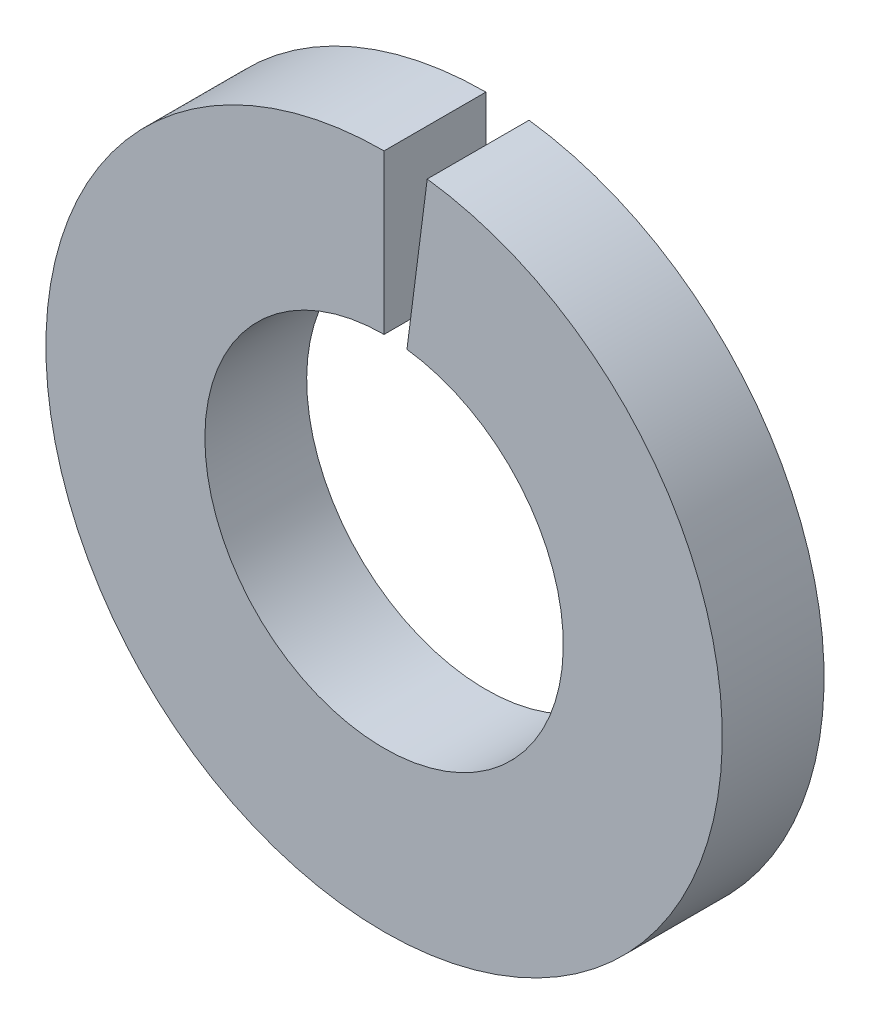
ISO-10303-21;
HEADER;
FILE_DESCRIPTION(('STEP AP214'),'2;1');
FILE_NAME('part.step','',(''),(''),'','','');
FILE_SCHEMA(('AUTOMOTIVE_DESIGN { 1 0 10303 214 1 1 1 1 }'));
ENDSEC;
DATA;
#1=APPLICATION_CONTEXT('core data for automotive mechanical design processes');
#2=APPLICATION_PROTOCOL_DEFINITION('international standard','automotive_design',2000,#1);
#3=PRODUCT_CONTEXT('',#1,'mechanical');
#4=PRODUCT('Part','Part','',(#3));
#5=PRODUCT_RELATED_PRODUCT_CATEGORY('part','',(#4));
#6=PRODUCT_DEFINITION_FORMATION('','',#4);
#7=PRODUCT_DEFINITION_CONTEXT('part definition',#1,'design');
#8=PRODUCT_DEFINITION('design','',#6,#7);
#9=PRODUCT_DEFINITION_SHAPE('','',#8);
#10=(LENGTH_UNIT() NAMED_UNIT(*) SI_UNIT(.MILLI.,.METRE.));
#11=(NAMED_UNIT(*) PLANE_ANGLE_UNIT() SI_UNIT($,.RADIAN.));
#12=(NAMED_UNIT(*) SI_UNIT($,.STERADIAN.) SOLID_ANGLE_UNIT());
#13=UNCERTAINTY_MEASURE_WITH_UNIT(LENGTH_MEASURE(1.E-05),#10,'distance_accuracy_value','');
#14=(GEOMETRIC_REPRESENTATION_CONTEXT(3) GLOBAL_UNCERTAINTY_ASSIGNED_CONTEXT((#13)) GLOBAL_UNIT_ASSIGNED_CONTEXT((#10,
#11,#12)) REPRESENTATION_CONTEXT('',''));
#15=CARTESIAN_POINT('',(0.,0.,0.));
#16=DIRECTION('',(0.,0.,1.));
#17=DIRECTION('',(1.,0.,0.));
#18=AXIS2_PLACEMENT_3D('',#15,#16,#17);
#19=CARTESIAN_POINT('',(0.,0.,1.8542));
#20=DIRECTION('',(0.,0.,1.));
#21=DIRECTION('',(1.,0.,0.));
#22=AXIS2_PLACEMENT_3D('',#19,#20,#21);
#23=PLANE('',#22);
#24=DIRECTION('',(0.127599136443187,0.991825821593163,0.));
#25=VECTOR('',#24,1.);
#26=CARTESIAN_POINT('',(0.,0.,1.8542));
#27=LINE('',#26,#25);
#28=CARTESIAN_POINT('',(0.416470821436917,3.23722029909792,1.8542));
#29=VERTEX_POINT('',#28);
#30=CARTESIAN_POINT('',(0.785946880921808,6.10915114810309,1.8542));
#31=VERTEX_POINT('',#30);
#32=EDGE_CURVE('E73',#29,#31,#27,.T.);
#33=ORIENTED_EDGE('',*,*,#32,.F.);
#34=CARTESIAN_POINT('',(0.,0.,1.8542));
#35=DIRECTION('',(0.,0.,1.));
#36=DIRECTION('',(1.,0.,0.));
#37=AXIS2_PLACEMENT_3D('',#34,#35,#36);
#38=CIRCLE('',#37,3.2639);
#39=CARTESIAN_POINT('',(0.,3.2639,1.8542));
#40=VERTEX_POINT('',#39);
#41=EDGE_CURVE('E92',#40,#29,#38,.T.);
#42=ORIENTED_EDGE('',*,*,#41,.F.);
#43=DIRECTION('',(0.,-1.,0.));
#44=VECTOR('',#43,1.);
#45=CARTESIAN_POINT('',(0.,0.,1.8542));
#46=LINE('',#45,#44);
#47=CARTESIAN_POINT('',(0.,6.1595,1.8542));
#48=VERTEX_POINT('',#47);
#49=EDGE_CURVE('E54',#48,#40,#46,.T.);
#50=ORIENTED_EDGE('',*,*,#49,.F.);
#51=CARTESIAN_POINT('',(0.,0.,1.8542));
#52=DIRECTION('',(0.,0.,1.));
#53=DIRECTION('',(1.,0.,0.));
#54=AXIS2_PLACEMENT_3D('',#51,#52,#53);
#55=CIRCLE('',#54,6.1595);
#56=EDGE_CURVE('E91',#48,#31,#55,.T.);
#57=ORIENTED_EDGE('',*,*,#56,.T.);
#58=EDGE_LOOP('',(#33,#42,#50,#57));
#59=FACE_BOUND('',#58,.T.);
#60=ADVANCED_FACE('F32',(#59),#23,.T.);
#61=CARTESIAN_POINT('',(0.,0.,0.));
#62=DIRECTION('',(0.,0.,1.));
#63=DIRECTION('',(1.,0.,0.));
#64=AXIS2_PLACEMENT_3D('',#61,#62,#63);
#65=PLANE('',#64);
#66=CARTESIAN_POINT('',(0.,0.,0.));
#67=DIRECTION('',(0.,0.,1.));
#68=DIRECTION('',(1.,0.,0.));
#69=AXIS2_PLACEMENT_3D('',#66,#67,#68);
#70=CIRCLE('',#69,3.2639);
#71=CARTESIAN_POINT('',(0.,3.2639,0.));
#72=VERTEX_POINT('',#71);
#73=CARTESIAN_POINT('',(0.416470821436917,3.23722029909793,0.));
#74=VERTEX_POINT('',#73);
#75=EDGE_CURVE('E88',#72,#74,#70,.T.);
#76=ORIENTED_EDGE('',*,*,#75,.T.);
#77=DIRECTION('',(0.127599136443187,0.991825821593163,0.));
#78=VECTOR('',#77,1.);
#79=CARTESIAN_POINT('',(0.,0.,0.));
#80=LINE('',#79,#78);
#81=CARTESIAN_POINT('',(0.785946880921808,6.10915114810309,0.));
#82=VERTEX_POINT('',#81);
#83=EDGE_CURVE('E46',#74,#82,#80,.T.);
#84=ORIENTED_EDGE('',*,*,#83,.T.);
#85=CARTESIAN_POINT('',(0.,0.,0.));
#86=DIRECTION('',(0.,0.,1.));
#87=DIRECTION('',(1.,0.,0.));
#88=AXIS2_PLACEMENT_3D('',#85,#86,#87);
#89=CIRCLE('',#88,6.1595);
#90=CARTESIAN_POINT('',(0.,6.1595,0.));
#91=VERTEX_POINT('',#90);
#92=EDGE_CURVE('E86',#91,#82,#89,.T.);
#93=ORIENTED_EDGE('',*,*,#92,.F.);
#94=DIRECTION('',(0.,-1.,0.));
#95=VECTOR('',#94,1.);
#96=CARTESIAN_POINT('',(0.,0.,0.));
#97=LINE('',#96,#95);
#98=EDGE_CURVE('E79',#91,#72,#97,.T.);
#99=ORIENTED_EDGE('',*,*,#98,.T.);
#100=EDGE_LOOP('',(#76,#84,#93,#99));
#101=FACE_BOUND('',#100,.T.);
#102=ADVANCED_FACE('F84',(#101),#65,.F.);
#103=CARTESIAN_POINT('',(0.,0.,1.8542));
#104=DIRECTION('',(0.,0.,-1.));
#105=DIRECTION('',(-1.,0.,0.));
#106=AXIS2_PLACEMENT_3D('',#103,#104,#105);
#107=CYLINDRICAL_SURFACE('',#106,6.1595);
#108=ORIENTED_EDGE('',*,*,#92,.T.);
#109=DIRECTION('',(0.,0.,1.));
#110=VECTOR('',#109,1.);
#111=CARTESIAN_POINT('',(0.785946880921808,6.10915114810309,0.));
#112=LINE('',#111,#110);
#113=EDGE_CURVE('E70',#82,#31,#112,.T.);
#114=ORIENTED_EDGE('',*,*,#113,.T.);
#115=ORIENTED_EDGE('',*,*,#56,.F.);
#116=DIRECTION('',(0.,0.,1.));
#117=VECTOR('',#116,1.);
#118=CARTESIAN_POINT('',(0.,6.1595,0.));
#119=LINE('',#118,#117);
#120=EDGE_CURVE('E78',#91,#48,#119,.T.);
#121=ORIENTED_EDGE('',*,*,#120,.F.);
#122=EDGE_LOOP('',(#108,#114,#115,#121));
#123=FACE_BOUND('',#122,.T.);
#124=ADVANCED_FACE('F34',(#123),#107,.T.);
#125=CARTESIAN_POINT('',(0.,0.,1.8542));
#126=DIRECTION('',(0.,0.,-1.));
#127=DIRECTION('',(-1.,0.,0.));
#128=AXIS2_PLACEMENT_3D('',#125,#126,#127);
#129=CYLINDRICAL_SURFACE('',#128,3.2639);
#130=DIRECTION('',(0.,0.,-1.));
#131=VECTOR('',#130,1.);
#132=CARTESIAN_POINT('',(0.416470821436917,3.23722029909793,1.8542));
#133=LINE('',#132,#131);
#134=EDGE_CURVE('E11',#74,#29,#133,.F.);
#135=ORIENTED_EDGE('',*,*,#134,.F.);
#136=ORIENTED_EDGE('',*,*,#75,.F.);
#137=DIRECTION('',(0.,0.,-1.));
#138=VECTOR('',#137,1.);
#139=CARTESIAN_POINT('',(0.,3.2639,1.8542));
#140=LINE('',#139,#138);
#141=EDGE_CURVE('E40',#40,#72,#140,.T.);
#142=ORIENTED_EDGE('',*,*,#141,.F.);
#143=ORIENTED_EDGE('',*,*,#41,.T.);
#144=EDGE_LOOP('',(#135,#136,#142,#143));
#145=FACE_BOUND('',#144,.T.);
#146=ADVANCED_FACE('F102',(#145),#129,.F.);
#147=CARTESIAN_POINT('',(0.,0.,0.));
#148=DIRECTION('',(-1.,0.,0.));
#149=DIRECTION('',(0.,0.,1.));
#150=AXIS2_PLACEMENT_3D('',#147,#148,#149);
#151=PLANE('',#150);
#152=ORIENTED_EDGE('',*,*,#141,.T.);
#153=ORIENTED_EDGE('',*,*,#98,.F.);
#154=ORIENTED_EDGE('',*,*,#120,.T.);
#155=ORIENTED_EDGE('',*,*,#49,.T.);
#156=EDGE_LOOP('',(#152,#153,#154,#155));
#157=FACE_BOUND('',#156,.T.);
#158=ADVANCED_FACE('F98',(#157),#151,.F.);
#159=CARTESIAN_POINT('',(0.,0.,0.));
#160=DIRECTION('',(0.991825821593163,-0.127599136443187,0.));
#161=DIRECTION('',(0.127599136443187,0.991825821593163,0.));
#162=AXIS2_PLACEMENT_3D('',#159,#160,#161);
#163=PLANE('',#162);
#164=ORIENTED_EDGE('',*,*,#134,.T.);
#165=ORIENTED_EDGE('',*,*,#32,.T.);
#166=ORIENTED_EDGE('',*,*,#113,.F.);
#167=ORIENTED_EDGE('',*,*,#83,.F.);
#168=EDGE_LOOP('',(#164,#165,#166,#167));
#169=FACE_BOUND('',#168,.T.);
#170=ADVANCED_FACE('F71',(#169),#163,.F.);
#171=CLOSED_SHELL('',(#60,#102,#124,#146,#158,#170));
#172=MANIFOLD_SOLID_BREP('B2',#171);
#173=ADVANCED_BREP_SHAPE_REPRESENTATION('',(#18,#172),#14);
#174=SHAPE_DEFINITION_REPRESENTATION(#9,#173);
ENDSEC;
END-ISO-10303-21;
